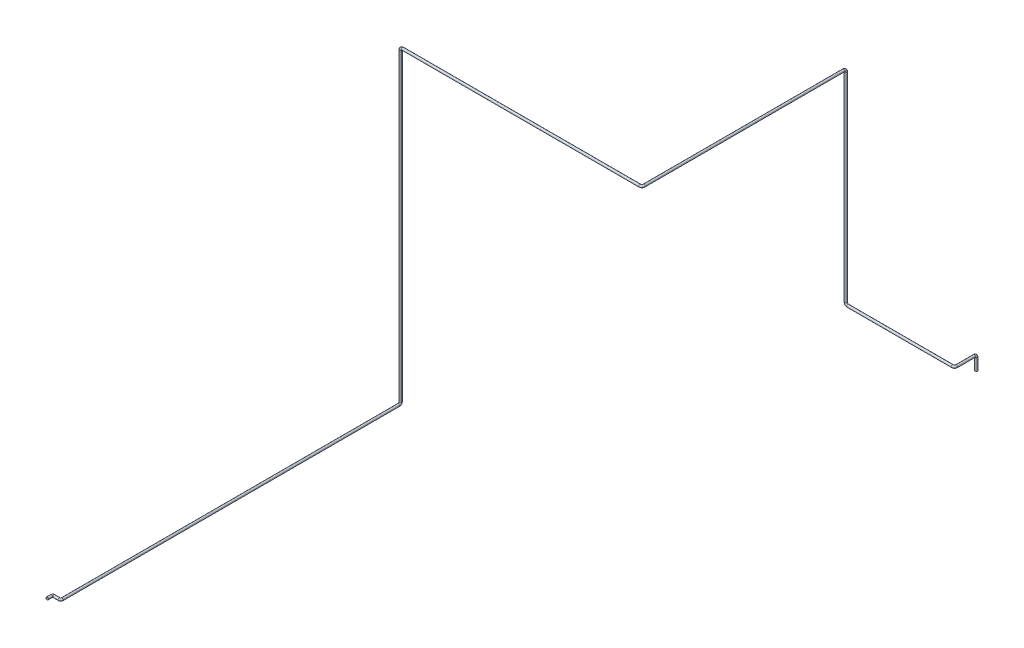
ISO-10303-21;
HEADER;
FILE_DESCRIPTION(('STEP AP214'),'2;1');
FILE_NAME('part.step','',(''),(''),'','','');
FILE_SCHEMA(('AUTOMOTIVE_DESIGN { 1 0 10303 214 1 1 1 1 }'));
ENDSEC;
DATA;
#1=APPLICATION_CONTEXT('core data for automotive mechanical design processes');
#2=APPLICATION_PROTOCOL_DEFINITION('international standard','automotive_design',2000,#1);
#3=PRODUCT_CONTEXT('',#1,'mechanical');
#4=PRODUCT('Part','Part','',(#3));
#5=PRODUCT_RELATED_PRODUCT_CATEGORY('part','',(#4));
#6=PRODUCT_DEFINITION_FORMATION('','',#4);
#7=PRODUCT_DEFINITION_CONTEXT('part definition',#1,'design');
#8=PRODUCT_DEFINITION('design','',#6,#7);
#9=PRODUCT_DEFINITION_SHAPE('','',#8);
#10=(LENGTH_UNIT() NAMED_UNIT(*) SI_UNIT(.MILLI.,.METRE.));
#11=(NAMED_UNIT(*) PLANE_ANGLE_UNIT() SI_UNIT($,.RADIAN.));
#12=(NAMED_UNIT(*) SI_UNIT($,.STERADIAN.) SOLID_ANGLE_UNIT());
#13=UNCERTAINTY_MEASURE_WITH_UNIT(LENGTH_MEASURE(1.E-05),#10,'distance_accuracy_value','');
#14=(GEOMETRIC_REPRESENTATION_CONTEXT(3) GLOBAL_UNCERTAINTY_ASSIGNED_CONTEXT((#13)) GLOBAL_UNIT_ASSIGNED_CONTEXT((#10,
#11,#12)) REPRESENTATION_CONTEXT('',''));
#15=CARTESIAN_POINT('',(0.,0.,0.));
#16=DIRECTION('',(0.,0.,1.));
#17=DIRECTION('',(1.,0.,0.));
#18=AXIS2_PLACEMENT_3D('',#15,#16,#17);
#19=CARTESIAN_POINT('',(0.,0.,-30.));
#20=DIRECTION('',(0.,0.,1.));
#21=DIRECTION('',(1.,0.,0.));
#22=AXIS2_PLACEMENT_3D('',#19,#20,#21);
#23=CYLINDRICAL_SURFACE('',#22,17.5);
#24=CARTESIAN_POINT('',(0.,0.,0.));
#25=DIRECTION('',(0.,0.,1.));
#26=DIRECTION('',(1.,0.,0.));
#27=AXIS2_PLACEMENT_3D('',#24,#25,#26);
#28=CIRCLE('',#27,17.5);
#29=CARTESIAN_POINT('',(17.5,0.,0.));
#30=VERTEX_POINT('',#29);
#31=EDGE_CURVE('E11',#30,#30,#28,.T.);
#32=ORIENTED_EDGE('',*,*,#31,.F.);
#33=EDGE_LOOP('',(#32));
#34=FACE_BOUND('',#33,.T.);
#35=CARTESIAN_POINT('',(0.,0.,-60.));
#36=DIRECTION('',(0.,0.,-1.));
#37=DIRECTION('',(-1.,0.,0.));
#38=AXIS2_PLACEMENT_3D('',#35,#36,#37);
#39=CIRCLE('',#38,17.5);
#40=CARTESIAN_POINT('',(-17.5,0.,-60.));
#41=VERTEX_POINT('',#40);
#42=EDGE_CURVE('E99',#41,#41,#39,.T.);
#43=ORIENTED_EDGE('',*,*,#42,.F.);
#44=EDGE_LOOP('',(#43));
#45=FACE_BOUND('',#44,.T.);
#46=ADVANCED_FACE('F35',(#34,#45),#23,.T.);
#47=CARTESIAN_POINT('',(0.,0.,0.));
#48=DIRECTION('',(0.,0.,1.));
#49=DIRECTION('',(1.,0.,0.));
#50=AXIS2_PLACEMENT_3D('',#47,#48,#49);
#51=PLANE('',#50);
#52=ORIENTED_EDGE('',*,*,#31,.T.);
#53=EDGE_LOOP('',(#52));
#54=FACE_BOUND('',#53,.T.);
#55=ADVANCED_FACE('F106',(#54),#51,.T.);
#56=CARTESIAN_POINT('',(5270.,1340.,-8400.));
#57=DIRECTION('',(0.,-1.,0.));
#58=DIRECTION('',(-1.,0.,0.));
#59=AXIS2_PLACEMENT_3D('',#56,#57,#58);
#60=PLANE('',#59);
#61=CARTESIAN_POINT('',(5270.,1340.,-8400.));
#62=DIRECTION('',(0.,-1.,0.));
#63=DIRECTION('',(-1.,0.,0.));
#64=AXIS2_PLACEMENT_3D('',#61,#62,#63);
#65=CIRCLE('',#64,17.5);
#66=CARTESIAN_POINT('',(5252.5,1340.,-8400.));
#67=VERTEX_POINT('',#66);
#68=EDGE_CURVE('E41',#67,#67,#65,.T.);
#69=ORIENTED_EDGE('',*,*,#68,.T.);
#70=EDGE_LOOP('',(#69));
#71=FACE_BOUND('',#70,.T.);
#72=ADVANCED_FACE('F45',(#71),#60,.T.);
#73=CARTESIAN_POINT('',(20.,0.,-60.));
#74=DIRECTION('',(0.,-1.,0.));
#75=DIRECTION('',(0.,0.,-1.));
#76=AXIS2_PLACEMENT_3D('',#73,#74,#75);
#77=TOROIDAL_SURFACE('',#76,20.,17.5);
#78=CARTESIAN_POINT('',(20.,0.,-80.));
#79=DIRECTION('',(1.,0.,0.));
#80=DIRECTION('',(0.,0.,-1.));
#81=AXIS2_PLACEMENT_3D('',#78,#79,#80);
#82=CIRCLE('',#81,17.5);
#83=CARTESIAN_POINT('',(20.,0.,-97.5));
#84=VERTEX_POINT('',#83);
#85=EDGE_CURVE('E96',#84,#84,#82,.T.);
#86=CARTESIAN_POINT('',(20.,0.,-60.));
#87=DIRECTION('',(0.,-1.,0.));
#88=DIRECTION('',(0.,0.,-1.));
#89=AXIS2_PLACEMENT_3D('',#86,#87,#88);
#90=CIRCLE('',#89,37.5);
#91=EDGE_CURVE('',#41,#84,#90,.T.);
#92=ORIENTED_EDGE('',*,*,#42,.T.);
#93=ORIENTED_EDGE('',*,*,#85,.F.);
#94=ORIENTED_EDGE('',*,*,#91,.T.);
#95=ORIENTED_EDGE('',*,*,#91,.F.);
#96=EDGE_LOOP('',(#92,#94,#93,#95));
#97=FACE_BOUND('',#96,.T.);
#98=ADVANCED_FACE('F103',(#97),#77,.T.);
#99=CARTESIAN_POINT('',(20.,0.,-80.));
#100=DIRECTION('',(1.,0.,0.));
#101=DIRECTION('',(0.,0.,-1.));
#102=AXIS2_PLACEMENT_3D('',#99,#100,#101);
#103=CYLINDRICAL_SURFACE('',#102,17.5);
#104=CARTESIAN_POINT('',(100.,0.,-80.));
#105=DIRECTION('',(1.,0.,0.));
#106=DIRECTION('',(0.,0.,-1.));
#107=AXIS2_PLACEMENT_3D('',#104,#105,#106);
#108=CIRCLE('',#107,17.5);
#109=CARTESIAN_POINT('',(100.,0.,-62.5));
#110=VERTEX_POINT('',#109);
#111=EDGE_CURVE('E93',#110,#110,#108,.T.);
#112=ORIENTED_EDGE('',*,*,#111,.F.);
#113=EDGE_LOOP('',(#112));
#114=FACE_BOUND('',#113,.T.);
#115=ORIENTED_EDGE('',*,*,#85,.T.);
#116=EDGE_LOOP('',(#115));
#117=FACE_BOUND('',#116,.T.);
#118=ADVANCED_FACE('F183',(#114,#117),#103,.T.);
#119=CARTESIAN_POINT('',(100.,0.,-100.));
#120=DIRECTION('',(0.,1.,0.));
#121=DIRECTION('',(0.,0.,1.));
#122=AXIS2_PLACEMENT_3D('',#119,#120,#121);
#123=TOROIDAL_SURFACE('',#122,20.,17.5);
#124=CARTESIAN_POINT('',(120.,0.,-100.));
#125=DIRECTION('',(0.,0.,-1.));
#126=DIRECTION('',(-1.,0.,0.));
#127=AXIS2_PLACEMENT_3D('',#124,#125,#126);
#128=CIRCLE('',#127,17.5);
#129=CARTESIAN_POINT('',(137.5,0.,-100.));
#130=VERTEX_POINT('',#129);
#131=EDGE_CURVE('E90',#130,#130,#128,.T.);
#132=CARTESIAN_POINT('',(100.,0.,-100.));
#133=DIRECTION('',(0.,1.,0.));
#134=DIRECTION('',(0.,0.,1.));
#135=AXIS2_PLACEMENT_3D('',#132,#133,#134);
#136=CIRCLE('',#135,37.5);
#137=EDGE_CURVE('',#110,#130,#136,.T.);
#138=ORIENTED_EDGE('',*,*,#111,.T.);
#139=ORIENTED_EDGE('',*,*,#131,.F.);
#140=ORIENTED_EDGE('',*,*,#137,.T.);
#141=ORIENTED_EDGE('',*,*,#137,.F.);
#142=EDGE_LOOP('',(#138,#140,#139,#141));
#143=FACE_BOUND('',#142,.T.);
#144=ADVANCED_FACE('F179',(#143),#123,.T.);
#145=CARTESIAN_POINT('',(120.,0.,-100.));
#146=DIRECTION('',(0.,0.,-1.));
#147=DIRECTION('',(-1.,0.,0.));
#148=AXIS2_PLACEMENT_3D('',#145,#146,#147);
#149=CYLINDRICAL_SURFACE('',#148,17.5);
#150=CARTESIAN_POINT('',(120.,0.,-5050.));
#151=DIRECTION('',(0.,0.,-1.));
#152=DIRECTION('',(-1.,0.,0.));
#153=AXIS2_PLACEMENT_3D('',#150,#151,#152);
#154=CIRCLE('',#153,17.5);
#155=CARTESIAN_POINT('',(120.,-17.5000000000001,-5050.));
#156=VERTEX_POINT('',#155);
#157=EDGE_CURVE('E87',#156,#156,#154,.T.);
#158=ORIENTED_EDGE('',*,*,#157,.F.);
#159=EDGE_LOOP('',(#158));
#160=FACE_BOUND('',#159,.T.);
#161=ORIENTED_EDGE('',*,*,#131,.T.);
#162=EDGE_LOOP('',(#161));
#163=FACE_BOUND('',#162,.T.);
#164=ADVANCED_FACE('F175',(#160,#163),#149,.T.);
#165=CARTESIAN_POINT('',(120.,30.,-5050.));
#166=DIRECTION('',(1.,0.,0.));
#167=DIRECTION('',(0.,0.,-1.));
#168=AXIS2_PLACEMENT_3D('',#165,#166,#167);
#169=TOROIDAL_SURFACE('',#168,30.0000000000001,17.5);
#170=CARTESIAN_POINT('',(120.,30.,-5080.));
#171=DIRECTION('',(0.,1.,0.));
#172=DIRECTION('',(-1.,0.,0.));
#173=AXIS2_PLACEMENT_3D('',#170,#171,#172);
#174=CIRCLE('',#173,17.5);
#175=CARTESIAN_POINT('',(120.,30.,-5097.5));
#176=VERTEX_POINT('',#175);
#177=EDGE_CURVE('E84',#176,#176,#174,.T.);
#178=CARTESIAN_POINT('',(120.,30.,-5050.));
#179=DIRECTION('',(1.,0.,0.));
#180=DIRECTION('',(0.,0.,-1.));
#181=AXIS2_PLACEMENT_3D('',#178,#179,#180);
#182=CIRCLE('',#181,47.5000000000001);
#183=EDGE_CURVE('',#156,#176,#182,.T.);
#184=ORIENTED_EDGE('',*,*,#157,.T.);
#185=ORIENTED_EDGE('',*,*,#177,.F.);
#186=ORIENTED_EDGE('',*,*,#183,.T.);
#187=ORIENTED_EDGE('',*,*,#183,.F.);
#188=EDGE_LOOP('',(#184,#186,#185,#187));
#189=FACE_BOUND('',#188,.T.);
#190=ADVANCED_FACE('F171',(#189),#169,.T.);
#191=CARTESIAN_POINT('',(120.,30.,-5080.));
#192=DIRECTION('',(0.,1.,0.));
#193=DIRECTION('',(0.,0.,1.));
#194=AXIS2_PLACEMENT_3D('',#191,#192,#193);
#195=CYLINDRICAL_SURFACE('',#194,17.5);
#196=CARTESIAN_POINT('',(120.,4510.,-5080.));
#197=DIRECTION('',(0.,1.,0.));
#198=DIRECTION('',(-1.,0.,0.));
#199=AXIS2_PLACEMENT_3D('',#196,#197,#198);
#200=CIRCLE('',#199,17.5);
#201=CARTESIAN_POINT('',(102.5,4510.,-5080.));
#202=VERTEX_POINT('',#201);
#203=EDGE_CURVE('E81',#202,#202,#200,.T.);
#204=ORIENTED_EDGE('',*,*,#203,.F.);
#205=EDGE_LOOP('',(#204));
#206=FACE_BOUND('',#205,.T.);
#207=ORIENTED_EDGE('',*,*,#177,.T.);
#208=EDGE_LOOP('',(#207));
#209=FACE_BOUND('',#208,.T.);
#210=ADVANCED_FACE('F167',(#206,#209),#195,.T.);
#211=CARTESIAN_POINT('',(150.,4510.,-5080.));
#212=DIRECTION('',(0.,0.,-1.));
#213=DIRECTION('',(-1.,0.,0.));
#214=AXIS2_PLACEMENT_3D('',#211,#212,#213);
#215=TOROIDAL_SURFACE('',#214,30.0000000000001,17.5);
#216=CARTESIAN_POINT('',(150.,4540.,-5080.));
#217=DIRECTION('',(1.,0.,0.));
#218=DIRECTION('',(0.,1.,0.));
#219=AXIS2_PLACEMENT_3D('',#216,#217,#218);
#220=CIRCLE('',#219,17.5);
#221=CARTESIAN_POINT('',(150.,4557.5,-5080.));
#222=VERTEX_POINT('',#221);
#223=EDGE_CURVE('E78',#222,#222,#220,.T.);
#224=CARTESIAN_POINT('',(150.,4510.,-5080.));
#225=DIRECTION('',(0.,0.,-1.));
#226=DIRECTION('',(-1.,0.,0.));
#227=AXIS2_PLACEMENT_3D('',#224,#225,#226);
#228=CIRCLE('',#227,47.5000000000001);
#229=EDGE_CURVE('',#202,#222,#228,.T.);
#230=ORIENTED_EDGE('',*,*,#203,.T.);
#231=ORIENTED_EDGE('',*,*,#223,.F.);
#232=ORIENTED_EDGE('',*,*,#229,.T.);
#233=ORIENTED_EDGE('',*,*,#229,.F.);
#234=EDGE_LOOP('',(#230,#232,#231,#233));
#235=FACE_BOUND('',#234,.T.);
#236=ADVANCED_FACE('F163',(#235),#215,.T.);
#237=CARTESIAN_POINT('',(150.,4540.,-5080.));
#238=DIRECTION('',(1.,0.,0.));
#239=DIRECTION('',(0.,0.,-1.));
#240=AXIS2_PLACEMENT_3D('',#237,#238,#239);
#241=CYLINDRICAL_SURFACE('',#240,17.5);
#242=CARTESIAN_POINT('',(3640.,4540.,-5080.));
#243=DIRECTION('',(1.,0.,0.));
#244=DIRECTION('',(0.,1.,0.));
#245=AXIS2_PLACEMENT_3D('',#242,#243,#244);
#246=CIRCLE('',#245,17.5);
#247=CARTESIAN_POINT('',(3640.,4540.,-5062.5));
#248=VERTEX_POINT('',#247);
#249=EDGE_CURVE('E75',#248,#248,#246,.T.);
#250=ORIENTED_EDGE('',*,*,#249,.F.);
#251=EDGE_LOOP('',(#250));
#252=FACE_BOUND('',#251,.T.);
#253=ORIENTED_EDGE('',*,*,#223,.T.);
#254=EDGE_LOOP('',(#253));
#255=FACE_BOUND('',#254,.T.);
#256=ADVANCED_FACE('F159',(#252,#255),#241,.T.);
#257=CARTESIAN_POINT('',(3640.,4540.,-5110.));
#258=DIRECTION('',(0.,1.,0.));
#259=DIRECTION('',(0.,0.,1.));
#260=AXIS2_PLACEMENT_3D('',#257,#258,#259);
#261=TOROIDAL_SURFACE('',#260,30.0000000000002,17.5);
#262=CARTESIAN_POINT('',(3670.,4540.,-5110.));
#263=DIRECTION('',(0.,0.,-1.));
#264=DIRECTION('',(0.,1.,0.));
#265=AXIS2_PLACEMENT_3D('',#262,#263,#264);
#266=CIRCLE('',#265,17.5);
#267=CARTESIAN_POINT('',(3687.5,4540.,-5110.));
#268=VERTEX_POINT('',#267);
#269=EDGE_CURVE('E72',#268,#268,#266,.T.);
#270=CARTESIAN_POINT('',(3640.,4540.,-5110.));
#271=DIRECTION('',(0.,1.,0.));
#272=DIRECTION('',(0.,0.,1.));
#273=AXIS2_PLACEMENT_3D('',#270,#271,#272);
#274=CIRCLE('',#273,47.5000000000002);
#275=EDGE_CURVE('',#248,#268,#274,.T.);
#276=ORIENTED_EDGE('',*,*,#249,.T.);
#277=ORIENTED_EDGE('',*,*,#269,.F.);
#278=ORIENTED_EDGE('',*,*,#275,.T.);
#279=ORIENTED_EDGE('',*,*,#275,.F.);
#280=EDGE_LOOP('',(#276,#278,#277,#279));
#281=FACE_BOUND('',#280,.T.);
#282=ADVANCED_FACE('F155',(#281),#261,.T.);
#283=CARTESIAN_POINT('',(3670.,4540.,-5110.));
#284=DIRECTION('',(0.,0.,-1.));
#285=DIRECTION('',(-1.,0.,0.));
#286=AXIS2_PLACEMENT_3D('',#283,#284,#285);
#287=CYLINDRICAL_SURFACE('',#286,17.5);
#288=CARTESIAN_POINT('',(3670.,4540.,-8050.));
#289=DIRECTION('',(0.,0.,-1.));
#290=DIRECTION('',(0.,1.,0.));
#291=AXIS2_PLACEMENT_3D('',#288,#289,#290);
#292=CIRCLE('',#291,17.5);
#293=CARTESIAN_POINT('',(3670.,4557.5,-8050.));
#294=VERTEX_POINT('',#293);
#295=EDGE_CURVE('E69',#294,#294,#292,.T.);
#296=ORIENTED_EDGE('',*,*,#295,.F.);
#297=EDGE_LOOP('',(#296));
#298=FACE_BOUND('',#297,.T.);
#299=ORIENTED_EDGE('',*,*,#269,.T.);
#300=EDGE_LOOP('',(#299));
#301=FACE_BOUND('',#300,.T.);
#302=ADVANCED_FACE('F151',(#298,#301),#287,.T.);
#303=CARTESIAN_POINT('',(3670.,4510.,-8050.));
#304=DIRECTION('',(-1.,0.,0.));
#305=DIRECTION('',(0.,0.,1.));
#306=AXIS2_PLACEMENT_3D('',#303,#304,#305);
#307=TOROIDAL_SURFACE('',#306,29.9999999999994,17.5);
#308=CARTESIAN_POINT('',(3670.,4510.,-8080.));
#309=DIRECTION('',(0.,-1.,0.));
#310=DIRECTION('',(0.,0.,-1.));
#311=AXIS2_PLACEMENT_3D('',#308,#309,#310);
#312=CIRCLE('',#311,17.5);
#313=CARTESIAN_POINT('',(3670.,4510.,-8097.5));
#314=VERTEX_POINT('',#313);
#315=EDGE_CURVE('E66',#314,#314,#312,.T.);
#316=CARTESIAN_POINT('',(3670.,4510.,-8050.));
#317=DIRECTION('',(-1.,0.,0.));
#318=DIRECTION('',(0.,0.,1.));
#319=AXIS2_PLACEMENT_3D('',#316,#317,#318);
#320=CIRCLE('',#319,47.4999999999994);
#321=EDGE_CURVE('',#294,#314,#320,.T.);
#322=ORIENTED_EDGE('',*,*,#295,.T.);
#323=ORIENTED_EDGE('',*,*,#315,.F.);
#324=ORIENTED_EDGE('',*,*,#321,.T.);
#325=ORIENTED_EDGE('',*,*,#321,.F.);
#326=EDGE_LOOP('',(#322,#324,#323,#325));
#327=FACE_BOUND('',#326,.T.);
#328=ADVANCED_FACE('F147',(#327),#307,.T.);
#329=CARTESIAN_POINT('',(3670.,4510.,-8080.));
#330=DIRECTION('',(0.,-1.,0.));
#331=DIRECTION('',(0.,0.,-1.));
#332=AXIS2_PLACEMENT_3D('',#329,#330,#331);
#333=CYLINDRICAL_SURFACE('',#332,17.5);
#334=CARTESIAN_POINT('',(3670.,1570.,-8080.));
#335=DIRECTION('',(0.,-1.,0.));
#336=DIRECTION('',(0.,0.,-1.));
#337=AXIS2_PLACEMENT_3D('',#334,#335,#336);
#338=CIRCLE('',#337,17.5);
#339=CARTESIAN_POINT('',(3652.5,1570.,-8080.));
#340=VERTEX_POINT('',#339);
#341=EDGE_CURVE('E63',#340,#340,#338,.T.);
#342=ORIENTED_EDGE('',*,*,#341,.F.);
#343=EDGE_LOOP('',(#342));
#344=FACE_BOUND('',#343,.T.);
#345=ORIENTED_EDGE('',*,*,#315,.T.);
#346=EDGE_LOOP('',(#345));
#347=FACE_BOUND('',#346,.T.);
#348=ADVANCED_FACE('F143',(#344,#347),#333,.T.);
#349=CARTESIAN_POINT('',(3700.,1570.,-8080.));
#350=DIRECTION('',(0.,0.,1.));
#351=DIRECTION('',(1.,0.,0.));
#352=AXIS2_PLACEMENT_3D('',#349,#350,#351);
#353=TOROIDAL_SURFACE('',#352,29.9999999999998,17.5);
#354=CARTESIAN_POINT('',(3700.,1540.,-8080.));
#355=DIRECTION('',(1.,0.,0.));
#356=DIRECTION('',(0.,0.,-1.));
#357=AXIS2_PLACEMENT_3D('',#354,#355,#356);
#358=CIRCLE('',#357,17.5);
#359=CARTESIAN_POINT('',(3700.,1522.5,-8080.));
#360=VERTEX_POINT('',#359);
#361=EDGE_CURVE('E60',#360,#360,#358,.T.);
#362=CARTESIAN_POINT('',(3700.,1570.,-8080.));
#363=DIRECTION('',(0.,0.,1.));
#364=DIRECTION('',(1.,0.,0.));
#365=AXIS2_PLACEMENT_3D('',#362,#363,#364);
#366=CIRCLE('',#365,47.4999999999998);
#367=EDGE_CURVE('',#340,#360,#366,.T.);
#368=ORIENTED_EDGE('',*,*,#341,.T.);
#369=ORIENTED_EDGE('',*,*,#361,.F.);
#370=ORIENTED_EDGE('',*,*,#367,.T.);
#371=ORIENTED_EDGE('',*,*,#367,.F.);
#372=EDGE_LOOP('',(#368,#370,#369,#371));
#373=FACE_BOUND('',#372,.T.);
#374=ADVANCED_FACE('F139',(#373),#353,.T.);
#375=CARTESIAN_POINT('',(3700.,1540.,-8080.));
#376=DIRECTION('',(1.,0.,0.));
#377=DIRECTION('',(0.,0.,-1.));
#378=AXIS2_PLACEMENT_3D('',#375,#376,#377);
#379=CYLINDRICAL_SURFACE('',#378,17.5);
#380=CARTESIAN_POINT('',(5240.,1540.,-8080.));
#381=DIRECTION('',(1.,0.,0.));
#382=DIRECTION('',(0.,0.,-1.));
#383=AXIS2_PLACEMENT_3D('',#380,#381,#382);
#384=CIRCLE('',#383,17.5);
#385=CARTESIAN_POINT('',(5240.,1540.,-8062.5));
#386=VERTEX_POINT('',#385);
#387=EDGE_CURVE('E57',#386,#386,#384,.T.);
#388=ORIENTED_EDGE('',*,*,#387,.F.);
#389=EDGE_LOOP('',(#388));
#390=FACE_BOUND('',#389,.T.);
#391=ORIENTED_EDGE('',*,*,#361,.T.);
#392=EDGE_LOOP('',(#391));
#393=FACE_BOUND('',#392,.T.);
#394=ADVANCED_FACE('F135',(#390,#393),#379,.T.);
#395=CARTESIAN_POINT('',(5240.,1540.,-8110.));
#396=DIRECTION('',(0.,1.,0.));
#397=DIRECTION('',(0.,0.,1.));
#398=AXIS2_PLACEMENT_3D('',#395,#396,#397);
#399=TOROIDAL_SURFACE('',#398,29.9999999999994,17.5);
#400=CARTESIAN_POINT('',(5270.,1540.,-8110.));
#401=DIRECTION('',(0.,0.,-1.));
#402=DIRECTION('',(-1.,0.,0.));
#403=AXIS2_PLACEMENT_3D('',#400,#401,#402);
#404=CIRCLE('',#403,17.5);
#405=CARTESIAN_POINT('',(5287.5,1540.,-8110.));
#406=VERTEX_POINT('',#405);
#407=EDGE_CURVE('E54',#406,#406,#404,.T.);
#408=CARTESIAN_POINT('',(5240.,1540.,-8110.));
#409=DIRECTION('',(0.,1.,0.));
#410=DIRECTION('',(0.,0.,1.));
#411=AXIS2_PLACEMENT_3D('',#408,#409,#410);
#412=CIRCLE('',#411,47.4999999999994);
#413=EDGE_CURVE('',#386,#406,#412,.T.);
#414=ORIENTED_EDGE('',*,*,#387,.T.);
#415=ORIENTED_EDGE('',*,*,#407,.F.);
#416=ORIENTED_EDGE('',*,*,#413,.T.);
#417=ORIENTED_EDGE('',*,*,#413,.F.);
#418=EDGE_LOOP('',(#414,#416,#415,#417));
#419=FACE_BOUND('',#418,.T.);
#420=ADVANCED_FACE('F131',(#419),#399,.T.);
#421=CARTESIAN_POINT('',(5270.,1540.,-8110.));
#422=DIRECTION('',(0.,0.,-1.));
#423=DIRECTION('',(-1.,0.,0.));
#424=AXIS2_PLACEMENT_3D('',#421,#422,#423);
#425=CYLINDRICAL_SURFACE('',#424,17.5);
#426=CARTESIAN_POINT('',(5270.,1540.,-8370.));
#427=DIRECTION('',(0.,0.,-1.));
#428=DIRECTION('',(-1.,0.,0.));
#429=AXIS2_PLACEMENT_3D('',#426,#427,#428);
#430=CIRCLE('',#429,17.5);
#431=CARTESIAN_POINT('',(5270.,1557.5,-8370.));
#432=VERTEX_POINT('',#431);
#433=EDGE_CURVE('E49',#432,#432,#430,.T.);
#434=ORIENTED_EDGE('',*,*,#433,.F.);
#435=EDGE_LOOP('',(#434));
#436=FACE_BOUND('',#435,.T.);
#437=ORIENTED_EDGE('',*,*,#407,.T.);
#438=EDGE_LOOP('',(#437));
#439=FACE_BOUND('',#438,.T.);
#440=ADVANCED_FACE('F124',(#436,#439),#425,.T.);
#441=CARTESIAN_POINT('',(5270.,1510.,-8370.));
#442=DIRECTION('',(-1.,0.,0.));
#443=DIRECTION('',(0.,0.,1.));
#444=AXIS2_PLACEMENT_3D('',#441,#442,#443);
#445=TOROIDAL_SURFACE('',#444,29.9999999999996,17.5);
#446=CARTESIAN_POINT('',(5270.,1510.,-8400.));
#447=DIRECTION('',(0.,-1.,0.));
#448=DIRECTION('',(-1.,0.,0.));
#449=AXIS2_PLACEMENT_3D('',#446,#447,#448);
#450=CIRCLE('',#449,17.5);
#451=CARTESIAN_POINT('',(5270.,1510.,-8417.5));
#452=VERTEX_POINT('',#451);
#453=EDGE_CURVE('E47',#452,#452,#450,.T.);
#454=CARTESIAN_POINT('',(5270.,1510.,-8370.));
#455=DIRECTION('',(-1.,0.,0.));
#456=DIRECTION('',(0.,0.,1.));
#457=AXIS2_PLACEMENT_3D('',#454,#455,#456);
#458=CIRCLE('',#457,47.4999999999996);
#459=EDGE_CURVE('',#432,#452,#458,.T.);
#460=ORIENTED_EDGE('',*,*,#433,.T.);
#461=ORIENTED_EDGE('',*,*,#453,.F.);
#462=ORIENTED_EDGE('',*,*,#459,.T.);
#463=ORIENTED_EDGE('',*,*,#459,.F.);
#464=EDGE_LOOP('',(#460,#462,#461,#463));
#465=FACE_BOUND('',#464,.T.);
#466=ADVANCED_FACE('F119',(#465),#445,.T.);
#467=CARTESIAN_POINT('',(5270.,1510.,-8400.));
#468=DIRECTION('',(0.,-1.,0.));
#469=DIRECTION('',(0.,0.,-1.));
#470=AXIS2_PLACEMENT_3D('',#467,#468,#469);
#471=CYLINDRICAL_SURFACE('',#470,17.5);
#472=ORIENTED_EDGE('',*,*,#68,.F.);
#473=EDGE_LOOP('',(#472));
#474=FACE_BOUND('',#473,.T.);
#475=ORIENTED_EDGE('',*,*,#453,.T.);
#476=EDGE_LOOP('',(#475));
#477=FACE_BOUND('',#476,.T.);
#478=ADVANCED_FACE('F112',(#474,#477),#471,.T.);
#479=CLOSED_SHELL('',(#46,#55,#72,#98,#118,#144,#164,#190,#210,#236,#256,#282,#302,#328,#348,
#374,#394,#420,#440,#466,#478));
#480=MANIFOLD_SOLID_BREP('B2',#479);
#481=ADVANCED_BREP_SHAPE_REPRESENTATION('',(#18,#480),#14);
#482=SHAPE_DEFINITION_REPRESENTATION(#9,#481);
ENDSEC;
END-ISO-10303-21;
